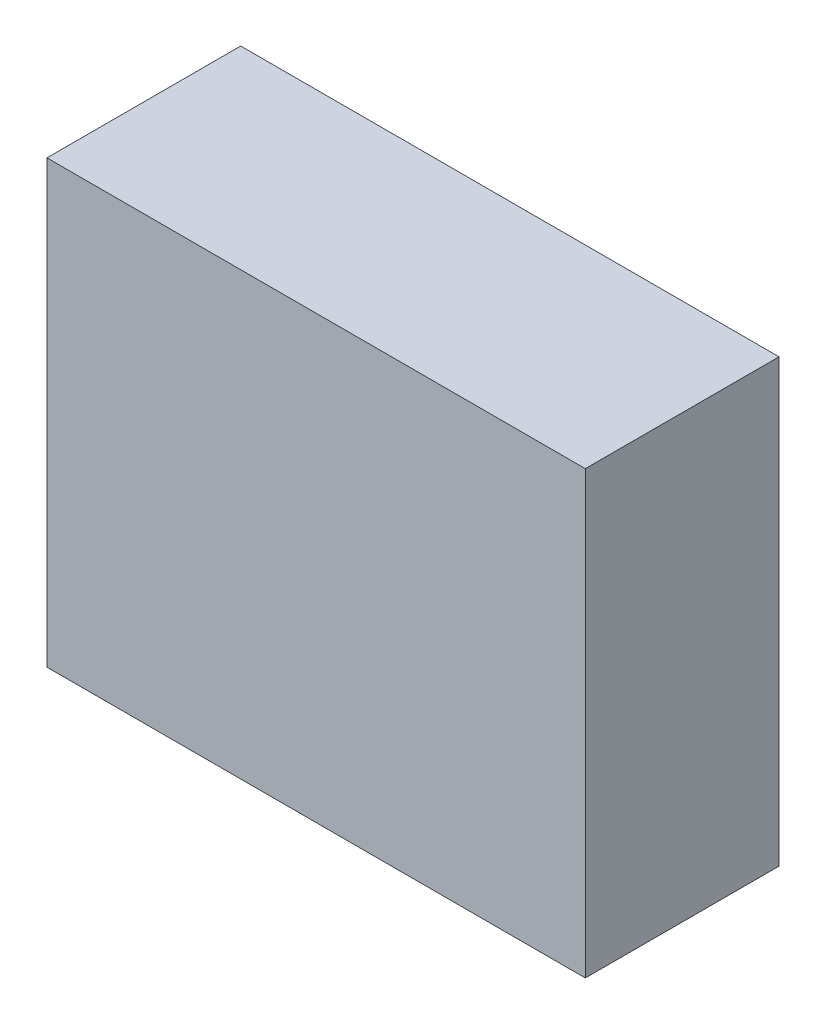
ISO-10303-21;
HEADER;
FILE_DESCRIPTION(('STEP AP214'),'2;1');
FILE_NAME('part.step','',(''),(''),'','','');
FILE_SCHEMA(('AUTOMOTIVE_DESIGN { 1 0 10303 214 1 1 1 1 }'));
ENDSEC;
DATA;
#1=APPLICATION_CONTEXT('core data for automotive mechanical design processes');
#2=APPLICATION_PROTOCOL_DEFINITION('international standard','automotive_design',2000,#1);
#3=PRODUCT_CONTEXT('',#1,'mechanical');
#4=PRODUCT('Part','Part','',(#3));
#5=PRODUCT_RELATED_PRODUCT_CATEGORY('part','',(#4));
#6=PRODUCT_DEFINITION_FORMATION('','',#4);
#7=PRODUCT_DEFINITION_CONTEXT('part definition',#1,'design');
#8=PRODUCT_DEFINITION('design','',#6,#7);
#9=PRODUCT_DEFINITION_SHAPE('','',#8);
#10=(LENGTH_UNIT() NAMED_UNIT(*) SI_UNIT(.MILLI.,.METRE.));
#11=(NAMED_UNIT(*) PLANE_ANGLE_UNIT() SI_UNIT($,.RADIAN.));
#12=(NAMED_UNIT(*) SI_UNIT($,.STERADIAN.) SOLID_ANGLE_UNIT());
#13=UNCERTAINTY_MEASURE_WITH_UNIT(LENGTH_MEASURE(1.E-05),#10,'distance_accuracy_value','');
#14=(GEOMETRIC_REPRESENTATION_CONTEXT(3) GLOBAL_UNCERTAINTY_ASSIGNED_CONTEXT((#13)) GLOBAL_UNIT_ASSIGNED_CONTEXT((#10,
#11,#12)) REPRESENTATION_CONTEXT('',''));
#15=CARTESIAN_POINT('',(0.,0.,0.));
#16=DIRECTION('',(0.,0.,1.));
#17=DIRECTION('',(1.,0.,0.));
#18=AXIS2_PLACEMENT_3D('',#15,#16,#17);
#19=CARTESIAN_POINT('',(0.,0.004,1.));
#20=DIRECTION('',(0.,0.,1.));
#21=DIRECTION('',(1.,0.,0.));
#22=AXIS2_PLACEMENT_3D('',#19,#20,#21);
#23=PLANE('',#22);
#24=DIRECTION('',(1.,0.,0.));
#25=VECTOR('',#24,1.);
#26=CARTESIAN_POINT('',(-1.3895,-1.1345,1.));
#27=LINE('',#26,#25);
#28=CARTESIAN_POINT('',(-1.3895,-1.1345,1.));
#29=VERTEX_POINT('',#28);
#30=CARTESIAN_POINT('',(1.3895,-1.1345,1.));
#31=VERTEX_POINT('',#30);
#32=EDGE_CURVE('E66',#29,#31,#27,.T.);
#33=ORIENTED_EDGE('',*,*,#32,.T.);
#34=DIRECTION('',(0.,1.,0.));
#35=VECTOR('',#34,1.);
#36=CARTESIAN_POINT('',(1.3895,-1.1345,1.));
#37=LINE('',#36,#35);
#38=CARTESIAN_POINT('',(1.3895,1.1425,1.));
#39=VERTEX_POINT('',#38);
#40=EDGE_CURVE('E88',#31,#39,#37,.T.);
#41=ORIENTED_EDGE('',*,*,#40,.T.);
#42=DIRECTION('',(-1.,0.,0.));
#43=VECTOR('',#42,1.);
#44=CARTESIAN_POINT('',(1.3895,1.1425,1.));
#45=LINE('',#44,#43);
#46=CARTESIAN_POINT('',(-1.3895,1.1425,1.));
#47=VERTEX_POINT('',#46);
#48=EDGE_CURVE('E68',#39,#47,#45,.T.);
#49=ORIENTED_EDGE('',*,*,#48,.T.);
#50=DIRECTION('',(0.,-1.,0.));
#51=VECTOR('',#50,1.);
#52=CARTESIAN_POINT('',(-1.3895,1.1425,1.));
#53=LINE('',#52,#51);
#54=EDGE_CURVE('E11',#47,#29,#53,.T.);
#55=ORIENTED_EDGE('',*,*,#54,.T.);
#56=EDGE_LOOP('',(#33,#41,#49,#55));
#57=FACE_BOUND('',#56,.T.);
#58=ADVANCED_FACE('F16',(#57),#23,.T.);
#59=CARTESIAN_POINT('',(0.,0.004,0.));
#60=DIRECTION('',(0.,0.,1.));
#61=DIRECTION('',(1.,0.,0.));
#62=AXIS2_PLACEMENT_3D('',#59,#60,#61);
#63=PLANE('',#62);
#64=DIRECTION('',(1.,0.,0.));
#65=VECTOR('',#64,1.);
#66=CARTESIAN_POINT('',(-1.3895,-1.1345,0.));
#67=LINE('',#66,#65);
#68=CARTESIAN_POINT('',(-1.3895,-1.1345,0.));
#69=VERTEX_POINT('',#68);
#70=CARTESIAN_POINT('',(1.3895,-1.1345,0.));
#71=VERTEX_POINT('',#70);
#72=EDGE_CURVE('E20',#69,#71,#67,.T.);
#73=ORIENTED_EDGE('',*,*,#72,.F.);
#74=DIRECTION('',(0.,-1.,0.));
#75=VECTOR('',#74,1.);
#76=CARTESIAN_POINT('',(-1.3895,1.1425,0.));
#77=LINE('',#76,#75);
#78=CARTESIAN_POINT('',(-1.3895,1.1425,0.));
#79=VERTEX_POINT('',#78);
#80=EDGE_CURVE('E27',#79,#69,#77,.T.);
#81=ORIENTED_EDGE('',*,*,#80,.F.);
#82=DIRECTION('',(-1.,0.,0.));
#83=VECTOR('',#82,1.);
#84=CARTESIAN_POINT('',(1.3895,1.1425,0.));
#85=LINE('',#84,#83);
#86=CARTESIAN_POINT('',(1.3895,1.1425,0.));
#87=VERTEX_POINT('',#86);
#88=EDGE_CURVE('E91',#87,#79,#85,.T.);
#89=ORIENTED_EDGE('',*,*,#88,.F.);
#90=DIRECTION('',(0.,1.,0.));
#91=VECTOR('',#90,1.);
#92=CARTESIAN_POINT('',(1.3895,-1.1345,0.));
#93=LINE('',#92,#91);
#94=EDGE_CURVE('E78',#71,#87,#93,.T.);
#95=ORIENTED_EDGE('',*,*,#94,.F.);
#96=EDGE_LOOP('',(#73,#81,#89,#95));
#97=FACE_BOUND('',#96,.T.);
#98=ADVANCED_FACE('F18',(#97),#63,.F.);
#99=CARTESIAN_POINT('',(-1.3895,1.1425,0.));
#100=DIRECTION('',(1.,0.,0.));
#101=DIRECTION('',(0.,1.,0.));
#102=AXIS2_PLACEMENT_3D('',#99,#100,#101);
#103=PLANE('',#102);
#104=DIRECTION('',(0.,0.,1.));
#105=VECTOR('',#104,1.);
#106=CARTESIAN_POINT('',(-1.3895,1.1425,0.));
#107=LINE('',#106,#105);
#108=EDGE_CURVE('E96',#79,#47,#107,.T.);
#109=ORIENTED_EDGE('',*,*,#108,.F.);
#110=ORIENTED_EDGE('',*,*,#80,.T.);
#111=DIRECTION('',(0.,0.,1.));
#112=VECTOR('',#111,1.);
#113=CARTESIAN_POINT('',(-1.3895,-1.1345,0.));
#114=LINE('',#113,#112);
#115=EDGE_CURVE('E74',#69,#29,#114,.T.);
#116=ORIENTED_EDGE('',*,*,#115,.T.);
#117=ORIENTED_EDGE('',*,*,#54,.F.);
#118=EDGE_LOOP('',(#109,#110,#116,#117));
#119=FACE_BOUND('',#118,.T.);
#120=ADVANCED_FACE('F80',(#119),#103,.F.);
#121=CARTESIAN_POINT('',(1.3895,1.1425,0.));
#122=DIRECTION('',(0.,-1.,0.));
#123=DIRECTION('',(0.,0.,-1.));
#124=AXIS2_PLACEMENT_3D('',#121,#122,#123);
#125=PLANE('',#124);
#126=DIRECTION('',(0.,0.,1.));
#127=VECTOR('',#126,1.);
#128=CARTESIAN_POINT('',(1.3895,1.1425,0.));
#129=LINE('',#128,#127);
#130=EDGE_CURVE('E92',#87,#39,#129,.T.);
#131=ORIENTED_EDGE('',*,*,#130,.F.);
#132=ORIENTED_EDGE('',*,*,#88,.T.);
#133=ORIENTED_EDGE('',*,*,#108,.T.);
#134=ORIENTED_EDGE('',*,*,#48,.F.);
#135=EDGE_LOOP('',(#131,#132,#133,#134));
#136=FACE_BOUND('',#135,.T.);
#137=ADVANCED_FACE('F117',(#136),#125,.F.);
#138=CARTESIAN_POINT('',(1.3895,-1.1345,0.));
#139=DIRECTION('',(-1.,0.,0.));
#140=DIRECTION('',(0.,0.,1.));
#141=AXIS2_PLACEMENT_3D('',#138,#139,#140);
#142=PLANE('',#141);
#143=DIRECTION('',(0.,0.,1.));
#144=VECTOR('',#143,1.);
#145=CARTESIAN_POINT('',(1.3895,-1.1345,0.));
#146=LINE('',#145,#144);
#147=EDGE_CURVE('E76',#71,#31,#146,.T.);
#148=ORIENTED_EDGE('',*,*,#147,.F.);
#149=ORIENTED_EDGE('',*,*,#94,.T.);
#150=ORIENTED_EDGE('',*,*,#130,.T.);
#151=ORIENTED_EDGE('',*,*,#40,.F.);
#152=EDGE_LOOP('',(#148,#149,#150,#151));
#153=FACE_BOUND('',#152,.T.);
#154=ADVANCED_FACE('F159',(#153),#142,.F.);
#155=CARTESIAN_POINT('',(-1.3895,-1.1345,0.));
#156=DIRECTION('',(0.,1.,0.));
#157=DIRECTION('',(1.,0.,0.));
#158=AXIS2_PLACEMENT_3D('',#155,#156,#157);
#159=PLANE('',#158);
#160=ORIENTED_EDGE('',*,*,#115,.F.);
#161=ORIENTED_EDGE('',*,*,#72,.T.);
#162=ORIENTED_EDGE('',*,*,#147,.T.);
#163=ORIENTED_EDGE('',*,*,#32,.F.);
#164=EDGE_LOOP('',(#160,#161,#162,#163));
#165=FACE_BOUND('',#164,.T.);
#166=ADVANCED_FACE('F72',(#165),#159,.F.);
#167=CLOSED_SHELL('',(#58,#98,#120,#137,#154,#166));
#168=MANIFOLD_SOLID_BREP('B1',#167);
#169=ADVANCED_BREP_SHAPE_REPRESENTATION('',(#18,#168),#14);
#170=SHAPE_DEFINITION_REPRESENTATION(#9,#169);
ENDSEC;
END-ISO-10303-21;
